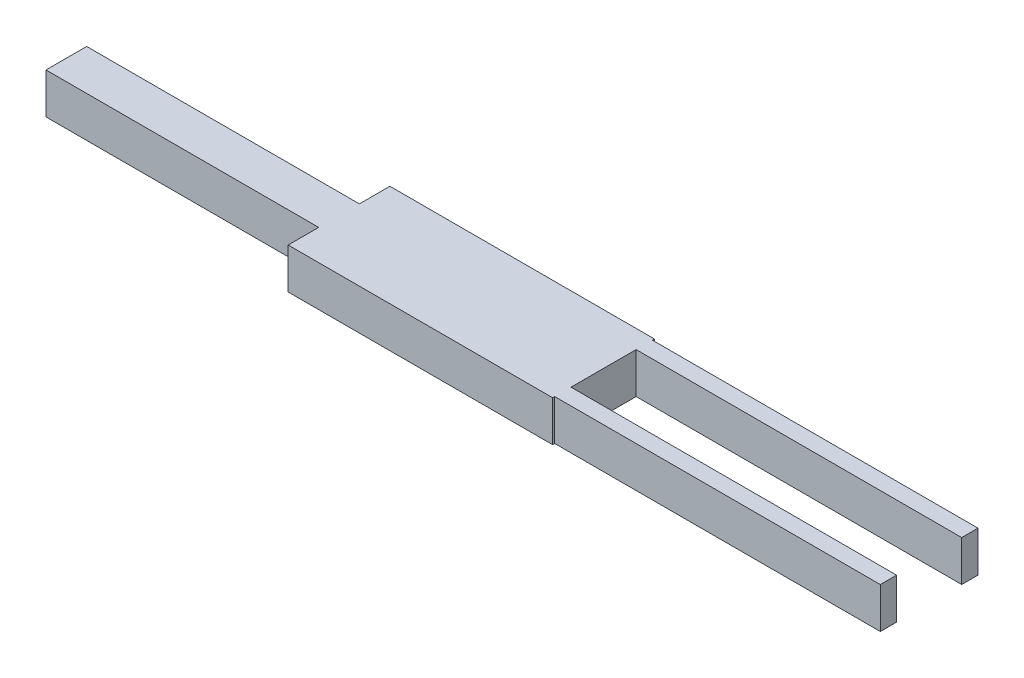
ISO-10303-21;
HEADER;
FILE_DESCRIPTION(('STEP AP214'),'2;1');
FILE_NAME('part.step','',(''),(''),'','','');
FILE_SCHEMA(('AUTOMOTIVE_DESIGN { 1 0 10303 214 1 1 1 1 }'));
ENDSEC;
DATA;
#1=APPLICATION_CONTEXT('core data for automotive mechanical design processes');
#2=APPLICATION_PROTOCOL_DEFINITION('international standard','automotive_design',2000,#1);
#3=PRODUCT_CONTEXT('',#1,'mechanical');
#4=PRODUCT('Part','Part','',(#3));
#5=PRODUCT_RELATED_PRODUCT_CATEGORY('part','',(#4));
#6=PRODUCT_DEFINITION_FORMATION('','',#4);
#7=PRODUCT_DEFINITION_CONTEXT('part definition',#1,'design');
#8=PRODUCT_DEFINITION('design','',#6,#7);
#9=PRODUCT_DEFINITION_SHAPE('','',#8);
#10=(LENGTH_UNIT() NAMED_UNIT(*) SI_UNIT(.MILLI.,.METRE.));
#11=(NAMED_UNIT(*) PLANE_ANGLE_UNIT() SI_UNIT($,.RADIAN.));
#12=(NAMED_UNIT(*) SI_UNIT($,.STERADIAN.) SOLID_ANGLE_UNIT());
#13=UNCERTAINTY_MEASURE_WITH_UNIT(LENGTH_MEASURE(1.E-05),#10,'distance_accuracy_value','');
#14=(GEOMETRIC_REPRESENTATION_CONTEXT(3) GLOBAL_UNCERTAINTY_ASSIGNED_CONTEXT((#13)) GLOBAL_UNIT_ASSIGNED_CONTEXT((#10,
#11,#12)) REPRESENTATION_CONTEXT('',''));
#15=CARTESIAN_POINT('',(0.,0.,0.));
#16=DIRECTION('',(0.,0.,1.));
#17=DIRECTION('',(1.,0.,0.));
#18=AXIS2_PLACEMENT_3D('',#15,#16,#17);
#19=CARTESIAN_POINT('',(251.197875897678,10.,-10.1864142560755));
#20=DIRECTION('',(-1.,0.,0.));
#21=DIRECTION('',(0.,0.,1.));
#22=AXIS2_PLACEMENT_3D('',#19,#20,#21);
#23=PLANE('',#22);
#24=DIRECTION('',(0.,0.,-1.));
#25=VECTOR('',#24,1.);
#26=CARTESIAN_POINT('',(251.197875897678,0.,-10.1864142560755));
#27=LINE('',#26,#25);
#28=CARTESIAN_POINT('',(251.197875897678,0.,-10.1864142560755));
#29=VERTEX_POINT('',#28);
#30=CARTESIAN_POINT('',(251.197875897678,0.,-14.1864142560755));
#31=VERTEX_POINT('',#30);
#32=EDGE_CURVE('E177',#29,#31,#27,.T.);
#33=ORIENTED_EDGE('',*,*,#32,.T.);
#34=DIRECTION('',(0.,-1.,0.));
#35=VECTOR('',#34,1.);
#36=CARTESIAN_POINT('',(251.197875897678,10.,-14.1864142560755));
#37=LINE('',#36,#35);
#38=CARTESIAN_POINT('',(251.197875897678,10.,-14.1864142560755));
#39=VERTEX_POINT('',#38);
#40=EDGE_CURVE('E11',#39,#31,#37,.T.);
#41=ORIENTED_EDGE('',*,*,#40,.F.);
#42=DIRECTION('',(0.,0.,-1.));
#43=VECTOR('',#42,1.);
#44=CARTESIAN_POINT('',(251.197875897678,10.,-10.1864142560755));
#45=LINE('',#44,#43);
#46=CARTESIAN_POINT('',(251.197875897678,10.,-10.1864142560755));
#47=VERTEX_POINT('',#46);
#48=EDGE_CURVE('E207',#47,#39,#45,.T.);
#49=ORIENTED_EDGE('',*,*,#48,.F.);
#50=DIRECTION('',(0.,-1.,0.));
#51=VECTOR('',#50,1.);
#52=CARTESIAN_POINT('',(251.197875897678,10.,-10.1864142560755));
#53=LINE('',#52,#51);
#54=EDGE_CURVE('E173',#47,#29,#53,.T.);
#55=ORIENTED_EDGE('',*,*,#54,.T.);
#56=EDGE_LOOP('',(#33,#41,#49,#55));
#57=FACE_BOUND('',#56,.T.);
#58=ADVANCED_FACE('F33',(#57),#23,.F.);
#59=CARTESIAN_POINT('',(251.197875897678,10.,-14.1864142560755));
#60=DIRECTION('',(0.,0.,1.));
#61=DIRECTION('',(1.,0.,0.));
#62=AXIS2_PLACEMENT_3D('',#59,#60,#61);
#63=PLANE('',#62);
#64=DIRECTION('',(-1.,0.,0.));
#65=VECTOR('',#64,1.);
#66=CARTESIAN_POINT('',(251.197875897678,0.,-14.1864142560755));
#67=LINE('',#66,#65);
#68=CARTESIAN_POINT('',(171.197875897678,0.,-14.1864142560755));
#69=VERTEX_POINT('',#68);
#70=EDGE_CURVE('E180',#31,#69,#67,.T.);
#71=ORIENTED_EDGE('',*,*,#70,.T.);
#72=DIRECTION('',(0.,-1.,0.));
#73=VECTOR('',#72,1.);
#74=CARTESIAN_POINT('',(171.197875897678,10.,-14.1864142560755));
#75=LINE('',#74,#73);
#76=CARTESIAN_POINT('',(171.197875897678,10.,-14.1864142560755));
#77=VERTEX_POINT('',#76);
#78=EDGE_CURVE('E41',#77,#69,#75,.T.);
#79=ORIENTED_EDGE('',*,*,#78,.F.);
#80=DIRECTION('',(-1.,0.,0.));
#81=VECTOR('',#80,1.);
#82=CARTESIAN_POINT('',(251.197875897678,10.,-14.1864142560755));
#83=LINE('',#82,#81);
#84=EDGE_CURVE('E116',#39,#77,#83,.T.);
#85=ORIENTED_EDGE('',*,*,#84,.F.);
#86=ORIENTED_EDGE('',*,*,#40,.T.);
#87=EDGE_LOOP('',(#71,#79,#85,#86));
#88=FACE_BOUND('',#87,.T.);
#89=ADVANCED_FACE('F305',(#88),#63,.F.);
#90=CARTESIAN_POINT('',(171.197875897678,10.,-14.1864142560755));
#91=DIRECTION('',(-1.,0.,0.));
#92=DIRECTION('',(0.,0.,1.));
#93=AXIS2_PLACEMENT_3D('',#90,#91,#92);
#94=PLANE('',#93);
#95=DIRECTION('',(0.,0.,-1.));
#96=VECTOR('',#95,1.);
#97=CARTESIAN_POINT('',(171.197875897678,0.,-14.1864142560755));
#98=LINE('',#97,#96);
#99=CARTESIAN_POINT('',(171.197875897678,0.,-14.6864142560755));
#100=VERTEX_POINT('',#99);
#101=EDGE_CURVE('E182',#69,#100,#98,.T.);
#102=ORIENTED_EDGE('',*,*,#101,.T.);
#103=DIRECTION('',(0.,-1.,0.));
#104=VECTOR('',#103,1.);
#105=CARTESIAN_POINT('',(171.197875897678,10.,-14.6864142560755));
#106=LINE('',#105,#104);
#107=CARTESIAN_POINT('',(171.197875897678,10.,-14.6864142560755));
#108=VERTEX_POINT('',#107);
#109=EDGE_CURVE('E238',#108,#100,#106,.T.);
#110=ORIENTED_EDGE('',*,*,#109,.F.);
#111=DIRECTION('',(0.,0.,-1.));
#112=VECTOR('',#111,1.);
#113=CARTESIAN_POINT('',(171.197875897678,10.,-14.1864142560755));
#114=LINE('',#113,#112);
#115=EDGE_CURVE('E246',#77,#108,#114,.T.);
#116=ORIENTED_EDGE('',*,*,#115,.F.);
#117=ORIENTED_EDGE('',*,*,#78,.T.);
#118=EDGE_LOOP('',(#102,#110,#116,#117));
#119=FACE_BOUND('',#118,.T.);
#120=ADVANCED_FACE('F244',(#119),#94,.F.);
#121=CARTESIAN_POINT('',(171.197875897678,10.,-14.6864142560755));
#122=DIRECTION('',(0.,0.,1.));
#123=DIRECTION('',(1.,0.,0.));
#124=AXIS2_PLACEMENT_3D('',#121,#122,#123);
#125=PLANE('',#124);
#126=DIRECTION('',(-1.,0.,0.));
#127=VECTOR('',#126,1.);
#128=CARTESIAN_POINT('',(171.197875897678,0.,-14.6864142560755));
#129=LINE('',#128,#127);
#130=CARTESIAN_POINT('',(106.197875897678,0.,-14.6864142560755));
#131=VERTEX_POINT('',#130);
#132=EDGE_CURVE('E184',#100,#131,#129,.T.);
#133=ORIENTED_EDGE('',*,*,#132,.T.);
#134=DIRECTION('',(0.,-1.,0.));
#135=VECTOR('',#134,1.);
#136=CARTESIAN_POINT('',(106.197875897678,10.,-14.6864142560755));
#137=LINE('',#136,#135);
#138=CARTESIAN_POINT('',(106.197875897678,10.,-14.6864142560755));
#139=VERTEX_POINT('',#138);
#140=EDGE_CURVE('E235',#139,#131,#137,.T.);
#141=ORIENTED_EDGE('',*,*,#140,.F.);
#142=DIRECTION('',(-1.,0.,0.));
#143=VECTOR('',#142,1.);
#144=CARTESIAN_POINT('',(171.197875897678,10.,-14.6864142560755));
#145=LINE('',#144,#143);
#146=EDGE_CURVE('E264',#108,#139,#145,.T.);
#147=ORIENTED_EDGE('',*,*,#146,.F.);
#148=ORIENTED_EDGE('',*,*,#109,.T.);
#149=EDGE_LOOP('',(#133,#141,#147,#148));
#150=FACE_BOUND('',#149,.T.);
#151=ADVANCED_FACE('F255',(#150),#125,.F.);
#152=CARTESIAN_POINT('',(106.197875897678,10.,-14.6864142560755));
#153=DIRECTION('',(1.,0.,0.));
#154=DIRECTION('',(0.,0.,-1.));
#155=AXIS2_PLACEMENT_3D('',#152,#153,#154);
#156=PLANE('',#155);
#157=DIRECTION('',(0.,0.,1.));
#158=VECTOR('',#157,1.);
#159=CARTESIAN_POINT('',(106.197875897678,0.,-14.6864142560755));
#160=LINE('',#159,#158);
#161=CARTESIAN_POINT('',(106.197875897678,0.,-7.18641425607552));
#162=VERTEX_POINT('',#161);
#163=EDGE_CURVE('E186',#131,#162,#160,.T.);
#164=ORIENTED_EDGE('',*,*,#163,.T.);
#165=DIRECTION('',(0.,-1.,0.));
#166=VECTOR('',#165,1.);
#167=CARTESIAN_POINT('',(106.197875897678,10.,-7.18641425607552));
#168=LINE('',#167,#166);
#169=CARTESIAN_POINT('',(106.197875897678,10.,-7.18641425607552));
#170=VERTEX_POINT('',#169);
#171=EDGE_CURVE('E232',#170,#162,#168,.T.);
#172=ORIENTED_EDGE('',*,*,#171,.F.);
#173=DIRECTION('',(0.,0.,1.));
#174=VECTOR('',#173,1.);
#175=CARTESIAN_POINT('',(106.197875897678,10.,-14.6864142560755));
#176=LINE('',#175,#174);
#177=EDGE_CURVE('E261',#139,#170,#176,.T.);
#178=ORIENTED_EDGE('',*,*,#177,.F.);
#179=ORIENTED_EDGE('',*,*,#140,.T.);
#180=EDGE_LOOP('',(#164,#172,#178,#179));
#181=FACE_BOUND('',#180,.T.);
#182=ADVANCED_FACE('F259',(#181),#156,.F.);
#183=CARTESIAN_POINT('',(106.197875897678,10.,-7.18641425607552));
#184=DIRECTION('',(0.,0.,1.));
#185=DIRECTION('',(1.,0.,0.));
#186=AXIS2_PLACEMENT_3D('',#183,#184,#185);
#187=PLANE('',#186);
#188=DIRECTION('',(-1.,0.,0.));
#189=VECTOR('',#188,1.);
#190=CARTESIAN_POINT('',(106.197875897678,0.,-7.18641425607552));
#191=LINE('',#190,#189);
#192=CARTESIAN_POINT('',(39.1978758976785,0.,-7.1864142560755));
#193=VERTEX_POINT('',#192);
#194=EDGE_CURVE('E188',#162,#193,#191,.T.);
#195=ORIENTED_EDGE('',*,*,#194,.T.);
#196=DIRECTION('',(0.,-1.,0.));
#197=VECTOR('',#196,1.);
#198=CARTESIAN_POINT('',(39.1978758976785,10.,-7.1864142560755));
#199=LINE('',#198,#197);
#200=CARTESIAN_POINT('',(39.1978758976785,10.,-7.1864142560755));
#201=VERTEX_POINT('',#200);
#202=EDGE_CURVE('E229',#201,#193,#199,.T.);
#203=ORIENTED_EDGE('',*,*,#202,.F.);
#204=DIRECTION('',(-1.,0.,0.));
#205=VECTOR('',#204,1.);
#206=CARTESIAN_POINT('',(106.197875897678,10.,-7.18641425607552));
#207=LINE('',#206,#205);
#208=EDGE_CURVE('E263',#170,#201,#207,.T.);
#209=ORIENTED_EDGE('',*,*,#208,.F.);
#210=ORIENTED_EDGE('',*,*,#171,.T.);
#211=EDGE_LOOP('',(#195,#203,#209,#210));
#212=FACE_BOUND('',#211,.T.);
#213=ADVANCED_FACE('F318',(#212),#187,.F.);
#214=CARTESIAN_POINT('',(39.1978758976785,10.,-7.1864142560755));
#215=DIRECTION('',(1.,0.,0.));
#216=DIRECTION('',(0.,0.,-1.));
#217=AXIS2_PLACEMENT_3D('',#214,#215,#216);
#218=PLANE('',#217);
#219=DIRECTION('',(0.,0.,1.));
#220=VECTOR('',#219,1.);
#221=CARTESIAN_POINT('',(39.1978758976785,0.,-7.1864142560755));
#222=LINE('',#221,#220);
#223=CARTESIAN_POINT('',(39.1978758976784,0.,2.81358574392446));
#224=VERTEX_POINT('',#223);
#225=EDGE_CURVE('E190',#193,#224,#222,.T.);
#226=ORIENTED_EDGE('',*,*,#225,.T.);
#227=DIRECTION('',(0.,-1.,0.));
#228=VECTOR('',#227,1.);
#229=CARTESIAN_POINT('',(39.1978758976784,10.,2.81358574392446));
#230=LINE('',#229,#228);
#231=CARTESIAN_POINT('',(39.1978758976784,10.,2.81358574392446));
#232=VERTEX_POINT('',#231);
#233=EDGE_CURVE('E226',#232,#224,#230,.T.);
#234=ORIENTED_EDGE('',*,*,#233,.F.);
#235=DIRECTION('',(0.,0.,1.));
#236=VECTOR('',#235,1.);
#237=CARTESIAN_POINT('',(39.1978758976785,10.,-7.1864142560755));
#238=LINE('',#237,#236);
#239=EDGE_CURVE('E266',#201,#232,#238,.T.);
#240=ORIENTED_EDGE('',*,*,#239,.F.);
#241=ORIENTED_EDGE('',*,*,#202,.T.);
#242=EDGE_LOOP('',(#226,#234,#240,#241));
#243=FACE_BOUND('',#242,.T.);
#244=ADVANCED_FACE('F321',(#243),#218,.F.);
#245=CARTESIAN_POINT('',(39.1978758976784,10.,2.81358574392446));
#246=DIRECTION('',(0.,0.,-1.));
#247=DIRECTION('',(-1.,0.,0.));
#248=AXIS2_PLACEMENT_3D('',#245,#246,#247);
#249=PLANE('',#248);
#250=DIRECTION('',(1.,0.,0.));
#251=VECTOR('',#250,1.);
#252=CARTESIAN_POINT('',(39.1978758976784,0.,2.81358574392446));
#253=LINE('',#252,#251);
#254=CARTESIAN_POINT('',(106.197875897678,0.,2.81358574392445));
#255=VERTEX_POINT('',#254);
#256=EDGE_CURVE('E192',#224,#255,#253,.T.);
#257=ORIENTED_EDGE('',*,*,#256,.T.);
#258=DIRECTION('',(0.,-1.,0.));
#259=VECTOR('',#258,1.);
#260=CARTESIAN_POINT('',(106.197875897678,10.,2.81358574392445));
#261=LINE('',#260,#259);
#262=CARTESIAN_POINT('',(106.197875897678,10.,2.81358574392445));
#263=VERTEX_POINT('',#262);
#264=EDGE_CURVE('E223',#263,#255,#261,.T.);
#265=ORIENTED_EDGE('',*,*,#264,.F.);
#266=DIRECTION('',(1.,0.,0.));
#267=VECTOR('',#266,1.);
#268=CARTESIAN_POINT('',(39.1978758976784,10.,2.81358574392446));
#269=LINE('',#268,#267);
#270=EDGE_CURVE('E272',#232,#263,#269,.T.);
#271=ORIENTED_EDGE('',*,*,#270,.F.);
#272=ORIENTED_EDGE('',*,*,#233,.T.);
#273=EDGE_LOOP('',(#257,#265,#271,#272));
#274=FACE_BOUND('',#273,.T.);
#275=ADVANCED_FACE('F325',(#274),#249,.F.);
#276=CARTESIAN_POINT('',(106.197875897678,10.,2.81358574392445));
#277=DIRECTION('',(1.,0.,0.));
#278=DIRECTION('',(0.,0.,-1.));
#279=AXIS2_PLACEMENT_3D('',#276,#277,#278);
#280=PLANE('',#279);
#281=DIRECTION('',(0.,0.,1.));
#282=VECTOR('',#281,1.);
#283=CARTESIAN_POINT('',(106.197875897678,0.,2.81358574392445));
#284=LINE('',#283,#282);
#285=CARTESIAN_POINT('',(106.197875897678,0.,10.3135857439245));
#286=VERTEX_POINT('',#285);
#287=EDGE_CURVE('E194',#255,#286,#284,.T.);
#288=ORIENTED_EDGE('',*,*,#287,.T.);
#289=DIRECTION('',(0.,-1.,0.));
#290=VECTOR('',#289,1.);
#291=CARTESIAN_POINT('',(106.197875897678,10.,10.3135857439245));
#292=LINE('',#291,#290);
#293=CARTESIAN_POINT('',(106.197875897678,10.,10.3135857439245));
#294=VERTEX_POINT('',#293);
#295=EDGE_CURVE('E220',#294,#286,#292,.T.);
#296=ORIENTED_EDGE('',*,*,#295,.F.);
#297=DIRECTION('',(0.,0.,1.));
#298=VECTOR('',#297,1.);
#299=CARTESIAN_POINT('',(106.197875897678,10.,2.81358574392445));
#300=LINE('',#299,#298);
#301=EDGE_CURVE('E274',#263,#294,#300,.T.);
#302=ORIENTED_EDGE('',*,*,#301,.F.);
#303=ORIENTED_EDGE('',*,*,#264,.T.);
#304=EDGE_LOOP('',(#288,#296,#302,#303));
#305=FACE_BOUND('',#304,.T.);
#306=ADVANCED_FACE('F329',(#305),#280,.F.);
#307=CARTESIAN_POINT('',(106.197875897678,10.,10.3135857439245));
#308=DIRECTION('',(0.,0.,-1.));
#309=DIRECTION('',(-1.,0.,0.));
#310=AXIS2_PLACEMENT_3D('',#307,#308,#309);
#311=PLANE('',#310);
#312=DIRECTION('',(1.,0.,0.));
#313=VECTOR('',#312,1.);
#314=CARTESIAN_POINT('',(106.197875897678,0.,10.3135857439245));
#315=LINE('',#314,#313);
#316=CARTESIAN_POINT('',(171.197875897678,0.,10.3135857439245));
#317=VERTEX_POINT('',#316);
#318=EDGE_CURVE('E196',#286,#317,#315,.T.);
#319=ORIENTED_EDGE('',*,*,#318,.T.);
#320=DIRECTION('',(0.,-1.,0.));
#321=VECTOR('',#320,1.);
#322=CARTESIAN_POINT('',(171.197875897678,10.,10.3135857439245));
#323=LINE('',#322,#321);
#324=CARTESIAN_POINT('',(171.197875897678,10.,10.3135857439245));
#325=VERTEX_POINT('',#324);
#326=EDGE_CURVE('E217',#325,#317,#323,.T.);
#327=ORIENTED_EDGE('',*,*,#326,.F.);
#328=DIRECTION('',(1.,0.,0.));
#329=VECTOR('',#328,1.);
#330=CARTESIAN_POINT('',(106.197875897678,10.,10.3135857439245));
#331=LINE('',#330,#329);
#332=EDGE_CURVE('E276',#294,#325,#331,.T.);
#333=ORIENTED_EDGE('',*,*,#332,.F.);
#334=ORIENTED_EDGE('',*,*,#295,.T.);
#335=EDGE_LOOP('',(#319,#327,#333,#334));
#336=FACE_BOUND('',#335,.T.);
#337=ADVANCED_FACE('F333',(#336),#311,.F.);
#338=CARTESIAN_POINT('',(171.197875897678,10.,10.3135857439245));
#339=DIRECTION('',(-1.,0.,0.));
#340=DIRECTION('',(0.,0.,1.));
#341=AXIS2_PLACEMENT_3D('',#338,#339,#340);
#342=PLANE('',#341);
#343=DIRECTION('',(0.,0.,-1.));
#344=VECTOR('',#343,1.);
#345=CARTESIAN_POINT('',(171.197875897678,0.,10.3135857439245));
#346=LINE('',#345,#344);
#347=CARTESIAN_POINT('',(171.197875897678,0.,9.81358574392448));
#348=VERTEX_POINT('',#347);
#349=EDGE_CURVE('E198',#317,#348,#346,.T.);
#350=ORIENTED_EDGE('',*,*,#349,.T.);
#351=DIRECTION('',(0.,-1.,0.));
#352=VECTOR('',#351,1.);
#353=CARTESIAN_POINT('',(171.197875897678,10.,9.81358574392448));
#354=LINE('',#353,#352);
#355=CARTESIAN_POINT('',(171.197875897678,10.,9.81358574392448));
#356=VERTEX_POINT('',#355);
#357=EDGE_CURVE('E214',#356,#348,#354,.T.);
#358=ORIENTED_EDGE('',*,*,#357,.F.);
#359=DIRECTION('',(0.,0.,-1.));
#360=VECTOR('',#359,1.);
#361=CARTESIAN_POINT('',(171.197875897678,10.,10.3135857439245));
#362=LINE('',#361,#360);
#363=EDGE_CURVE('E278',#325,#356,#362,.T.);
#364=ORIENTED_EDGE('',*,*,#363,.F.);
#365=ORIENTED_EDGE('',*,*,#326,.T.);
#366=EDGE_LOOP('',(#350,#358,#364,#365));
#367=FACE_BOUND('',#366,.T.);
#368=ADVANCED_FACE('F337',(#367),#342,.F.);
#369=CARTESIAN_POINT('',(171.197875897678,10.,9.81358574392448));
#370=DIRECTION('',(0.,0.,-1.));
#371=DIRECTION('',(-1.,0.,0.));
#372=AXIS2_PLACEMENT_3D('',#369,#370,#371);
#373=PLANE('',#372);
#374=DIRECTION('',(1.,0.,0.));
#375=VECTOR('',#374,1.);
#376=CARTESIAN_POINT('',(171.197875897678,0.,9.81358574392448));
#377=LINE('',#376,#375);
#378=CARTESIAN_POINT('',(251.197875897678,0.,9.81358574392454));
#379=VERTEX_POINT('',#378);
#380=EDGE_CURVE('E200',#348,#379,#377,.T.);
#381=ORIENTED_EDGE('',*,*,#380,.T.);
#382=DIRECTION('',(0.,-1.,0.));
#383=VECTOR('',#382,1.);
#384=CARTESIAN_POINT('',(251.197875897678,10.,9.81358574392454));
#385=LINE('',#384,#383);
#386=CARTESIAN_POINT('',(251.197875897678,10.,9.81358574392454));
#387=VERTEX_POINT('',#386);
#388=EDGE_CURVE('E211',#387,#379,#385,.T.);
#389=ORIENTED_EDGE('',*,*,#388,.F.);
#390=DIRECTION('',(1.,0.,0.));
#391=VECTOR('',#390,1.);
#392=CARTESIAN_POINT('',(171.197875897678,10.,9.81358574392448));
#393=LINE('',#392,#391);
#394=EDGE_CURVE('E280',#356,#387,#393,.T.);
#395=ORIENTED_EDGE('',*,*,#394,.F.);
#396=ORIENTED_EDGE('',*,*,#357,.T.);
#397=EDGE_LOOP('',(#381,#389,#395,#396));
#398=FACE_BOUND('',#397,.T.);
#399=ADVANCED_FACE('F286',(#398),#373,.F.);
#400=CARTESIAN_POINT('',(251.197875897678,10.,9.81358574392454));
#401=DIRECTION('',(-1.,0.,0.));
#402=DIRECTION('',(0.,0.,1.));
#403=AXIS2_PLACEMENT_3D('',#400,#401,#402);
#404=PLANE('',#403);
#405=DIRECTION('',(0.,0.,-1.));
#406=VECTOR('',#405,1.);
#407=CARTESIAN_POINT('',(251.197875897678,0.,9.81358574392454));
#408=LINE('',#407,#406);
#409=CARTESIAN_POINT('',(251.197875897678,0.,5.81358574392454));
#410=VERTEX_POINT('',#409);
#411=EDGE_CURVE('E202',#379,#410,#408,.T.);
#412=ORIENTED_EDGE('',*,*,#411,.T.);
#413=DIRECTION('',(0.,-1.,0.));
#414=VECTOR('',#413,1.);
#415=CARTESIAN_POINT('',(251.197875897678,10.,5.81358574392454));
#416=LINE('',#415,#414);
#417=CARTESIAN_POINT('',(251.197875897678,10.,5.81358574392454));
#418=VERTEX_POINT('',#417);
#419=EDGE_CURVE('E168',#418,#410,#416,.T.);
#420=ORIENTED_EDGE('',*,*,#419,.F.);
#421=DIRECTION('',(0.,0.,-1.));
#422=VECTOR('',#421,1.);
#423=CARTESIAN_POINT('',(251.197875897678,10.,9.81358574392454));
#424=LINE('',#423,#422);
#425=EDGE_CURVE('E159',#387,#418,#424,.T.);
#426=ORIENTED_EDGE('',*,*,#425,.F.);
#427=ORIENTED_EDGE('',*,*,#388,.T.);
#428=EDGE_LOOP('',(#412,#420,#426,#427));
#429=FACE_BOUND('',#428,.T.);
#430=ADVANCED_FACE('F290',(#429),#404,.F.);
#431=CARTESIAN_POINT('',(171.197875897678,10.,5.81358574392454));
#432=DIRECTION('',(0.,0.,1.));
#433=DIRECTION('',(1.,0.,0.));
#434=AXIS2_PLACEMENT_3D('',#431,#432,#433);
#435=PLANE('',#434);
#436=DIRECTION('',(-1.,0.,0.));
#437=VECTOR('',#436,1.);
#438=CARTESIAN_POINT('',(171.197875897678,0.,5.81358574392454));
#439=LINE('',#438,#437);
#440=CARTESIAN_POINT('',(171.197875897678,0.,5.81358574392454));
#441=VERTEX_POINT('',#440);
#442=EDGE_CURVE('E167',#410,#441,#439,.T.);
#443=ORIENTED_EDGE('',*,*,#442,.T.);
#444=DIRECTION('',(0.,-1.,0.));
#445=VECTOR('',#444,1.);
#446=CARTESIAN_POINT('',(171.197875897678,10.,5.81358574392454));
#447=LINE('',#446,#445);
#448=CARTESIAN_POINT('',(171.197875897678,10.,5.81358574392454));
#449=VERTEX_POINT('',#448);
#450=EDGE_CURVE('E164',#449,#441,#447,.T.);
#451=ORIENTED_EDGE('',*,*,#450,.F.);
#452=DIRECTION('',(-1.,0.,0.));
#453=VECTOR('',#452,1.);
#454=CARTESIAN_POINT('',(171.197875897678,10.,5.81358574392454));
#455=LINE('',#454,#453);
#456=EDGE_CURVE('E153',#418,#449,#455,.T.);
#457=ORIENTED_EDGE('',*,*,#456,.F.);
#458=ORIENTED_EDGE('',*,*,#419,.T.);
#459=EDGE_LOOP('',(#443,#451,#457,#458));
#460=FACE_BOUND('',#459,.T.);
#461=ADVANCED_FACE('F165',(#460),#435,.F.);
#462=CARTESIAN_POINT('',(171.197875897678,10.,-10.1864142560755));
#463=DIRECTION('',(-1.,0.,0.));
#464=DIRECTION('',(0.,0.,1.));
#465=AXIS2_PLACEMENT_3D('',#462,#463,#464);
#466=PLANE('',#465);
#467=DIRECTION('',(0.,0.,-1.));
#468=VECTOR('',#467,1.);
#469=CARTESIAN_POINT('',(171.197875897678,0.,-10.1864142560755));
#470=LINE('',#469,#468);
#471=CARTESIAN_POINT('',(171.197875897678,0.,-10.1864142560755));
#472=VERTEX_POINT('',#471);
#473=EDGE_CURVE('E102',#441,#472,#470,.T.);
#474=ORIENTED_EDGE('',*,*,#473,.T.);
#475=DIRECTION('',(0.,-1.,0.));
#476=VECTOR('',#475,1.);
#477=CARTESIAN_POINT('',(171.197875897678,10.,-10.1864142560755));
#478=LINE('',#477,#476);
#479=CARTESIAN_POINT('',(171.197875897678,10.,-10.1864142560755));
#480=VERTEX_POINT('',#479);
#481=EDGE_CURVE('E169',#480,#472,#478,.T.);
#482=ORIENTED_EDGE('',*,*,#481,.F.);
#483=DIRECTION('',(0.,0.,-1.));
#484=VECTOR('',#483,1.);
#485=CARTESIAN_POINT('',(171.197875897678,10.,-10.1864142560755));
#486=LINE('',#485,#484);
#487=EDGE_CURVE('E157',#449,#480,#486,.T.);
#488=ORIENTED_EDGE('',*,*,#487,.F.);
#489=ORIENTED_EDGE('',*,*,#450,.T.);
#490=EDGE_LOOP('',(#474,#482,#488,#489));
#491=FACE_BOUND('',#490,.T.);
#492=ADVANCED_FACE('F171',(#491),#466,.F.);
#493=CARTESIAN_POINT('',(251.197875897678,10.,-10.1864142560755));
#494=DIRECTION('',(0.,0.,-1.));
#495=DIRECTION('',(-1.,0.,0.));
#496=AXIS2_PLACEMENT_3D('',#493,#494,#495);
#497=PLANE('',#496);
#498=DIRECTION('',(1.,0.,0.));
#499=VECTOR('',#498,1.);
#500=CARTESIAN_POINT('',(251.197875897678,0.,-10.1864142560755));
#501=LINE('',#500,#499);
#502=EDGE_CURVE('E108',#472,#29,#501,.T.);
#503=ORIENTED_EDGE('',*,*,#502,.T.);
#504=ORIENTED_EDGE('',*,*,#54,.F.);
#505=DIRECTION('',(1.,0.,0.));
#506=VECTOR('',#505,1.);
#507=CARTESIAN_POINT('',(251.197875897678,10.,-10.1864142560755));
#508=LINE('',#507,#506);
#509=EDGE_CURVE('E49',#480,#47,#508,.T.);
#510=ORIENTED_EDGE('',*,*,#509,.F.);
#511=ORIENTED_EDGE('',*,*,#481,.T.);
#512=EDGE_LOOP('',(#503,#504,#510,#511));
#513=FACE_BOUND('',#512,.T.);
#514=ADVANCED_FACE('F294',(#513),#497,.F.);
#515=CARTESIAN_POINT('',(0.,10.,0.));
#516=DIRECTION('',(0.,1.,0.));
#517=DIRECTION('',(0.,0.,1.));
#518=AXIS2_PLACEMENT_3D('',#515,#516,#517);
#519=PLANE('',#518);
#520=ORIENTED_EDGE('',*,*,#48,.T.);
#521=ORIENTED_EDGE('',*,*,#84,.T.);
#522=ORIENTED_EDGE('',*,*,#115,.T.);
#523=ORIENTED_EDGE('',*,*,#146,.T.);
#524=ORIENTED_EDGE('',*,*,#177,.T.);
#525=ORIENTED_EDGE('',*,*,#208,.T.);
#526=ORIENTED_EDGE('',*,*,#239,.T.);
#527=ORIENTED_EDGE('',*,*,#270,.T.);
#528=ORIENTED_EDGE('',*,*,#301,.T.);
#529=ORIENTED_EDGE('',*,*,#332,.T.);
#530=ORIENTED_EDGE('',*,*,#363,.T.);
#531=ORIENTED_EDGE('',*,*,#394,.T.);
#532=ORIENTED_EDGE('',*,*,#425,.T.);
#533=ORIENTED_EDGE('',*,*,#456,.T.);
#534=ORIENTED_EDGE('',*,*,#487,.T.);
#535=ORIENTED_EDGE('',*,*,#509,.T.);
#536=EDGE_LOOP('',(#520,#521,#522,#523,#524,#525,#526,#527,#528,#529,#530,#531,#532,#533,#534,#535));
#537=FACE_BOUND('',#536,.T.);
#538=ADVANCED_FACE('F155',(#537),#519,.T.);
#539=CARTESIAN_POINT('',(0.,0.,0.));
#540=DIRECTION('',(0.,1.,0.));
#541=DIRECTION('',(0.,0.,1.));
#542=AXIS2_PLACEMENT_3D('',#539,#540,#541);
#543=PLANE('',#542);
#544=ORIENTED_EDGE('',*,*,#32,.F.);
#545=ORIENTED_EDGE('',*,*,#502,.F.);
#546=ORIENTED_EDGE('',*,*,#473,.F.);
#547=ORIENTED_EDGE('',*,*,#442,.F.);
#548=ORIENTED_EDGE('',*,*,#411,.F.);
#549=ORIENTED_EDGE('',*,*,#380,.F.);
#550=ORIENTED_EDGE('',*,*,#349,.F.);
#551=ORIENTED_EDGE('',*,*,#318,.F.);
#552=ORIENTED_EDGE('',*,*,#287,.F.);
#553=ORIENTED_EDGE('',*,*,#256,.F.);
#554=ORIENTED_EDGE('',*,*,#225,.F.);
#555=ORIENTED_EDGE('',*,*,#194,.F.);
#556=ORIENTED_EDGE('',*,*,#163,.F.);
#557=ORIENTED_EDGE('',*,*,#132,.F.);
#558=ORIENTED_EDGE('',*,*,#101,.F.);
#559=ORIENTED_EDGE('',*,*,#70,.F.);
#560=EDGE_LOOP('',(#544,#545,#546,#547,#548,#549,#550,#551,#552,#553,#554,#555,#556,#557,#558,#559));
#561=FACE_BOUND('',#560,.T.);
#562=ADVANCED_FACE('F250',(#561),#543,.F.);
#563=CLOSED_SHELL('',(#58,#89,#120,#151,#182,#213,#244,#275,#306,#337,#368,#399,#430,#461,#492,
#514,#538,#562));
#564=MANIFOLD_SOLID_BREP('B2',#563);
#565=ADVANCED_BREP_SHAPE_REPRESENTATION('',(#18,#564),#14);
#566=SHAPE_DEFINITION_REPRESENTATION(#9,#565);
ENDSEC;
END-ISO-10303-21;
